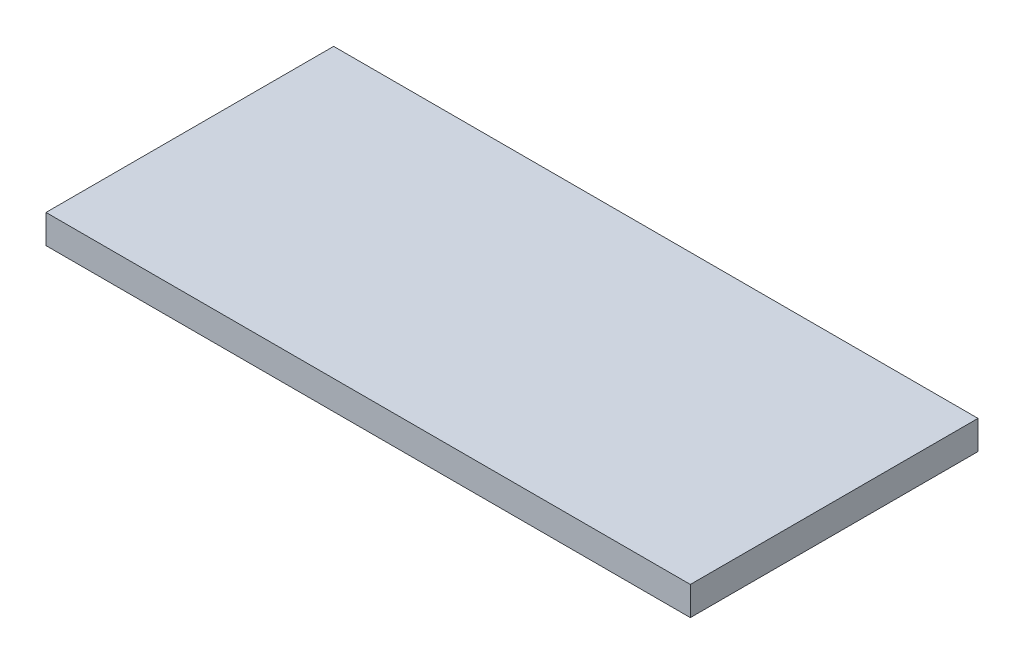
ISO-10303-21;
HEADER;
FILE_DESCRIPTION(('STEP AP214'),'2;1');
FILE_NAME('part.step','',(''),(''),'','','');
FILE_SCHEMA(('AUTOMOTIVE_DESIGN { 1 0 10303 214 1 1 1 1 }'));
ENDSEC;
DATA;
#1=APPLICATION_CONTEXT('core data for automotive mechanical design processes');
#2=APPLICATION_PROTOCOL_DEFINITION('international standard','automotive_design',2000,#1);
#3=PRODUCT_CONTEXT('',#1,'mechanical');
#4=PRODUCT('Part','Part','',(#3));
#5=PRODUCT_RELATED_PRODUCT_CATEGORY('part','',(#4));
#6=PRODUCT_DEFINITION_FORMATION('','',#4);
#7=PRODUCT_DEFINITION_CONTEXT('part definition',#1,'design');
#8=PRODUCT_DEFINITION('design','',#6,#7);
#9=PRODUCT_DEFINITION_SHAPE('','',#8);
#10=(LENGTH_UNIT() NAMED_UNIT(*) SI_UNIT(.MILLI.,.METRE.));
#11=(NAMED_UNIT(*) PLANE_ANGLE_UNIT() SI_UNIT($,.RADIAN.));
#12=(NAMED_UNIT(*) SI_UNIT($,.STERADIAN.) SOLID_ANGLE_UNIT());
#13=UNCERTAINTY_MEASURE_WITH_UNIT(LENGTH_MEASURE(1.E-05),#10,'distance_accuracy_value','');
#14=(GEOMETRIC_REPRESENTATION_CONTEXT(3) GLOBAL_UNCERTAINTY_ASSIGNED_CONTEXT((#13)) GLOBAL_UNIT_ASSIGNED_CONTEXT((#10,
#11,#12)) REPRESENTATION_CONTEXT('',''));
#15=CARTESIAN_POINT('',(0.,0.,0.));
#16=DIRECTION('',(0.,0.,1.));
#17=DIRECTION('',(1.,0.,0.));
#18=AXIS2_PLACEMENT_3D('',#15,#16,#17);
#19=CARTESIAN_POINT('',(-17.78,1.5875,7.9375));
#20=DIRECTION('',(1.,0.,0.));
#21=DIRECTION('',(0.,0.,-1.));
#22=AXIS2_PLACEMENT_3D('',#19,#20,#21);
#23=PLANE('',#22);
#24=DIRECTION('',(0.,0.,1.));
#25=VECTOR('',#24,1.);
#26=CARTESIAN_POINT('',(-17.78,0.,7.9375));
#27=LINE('',#26,#25);
#28=CARTESIAN_POINT('',(-17.78,0.,-7.9375));
#29=VERTEX_POINT('',#28);
#30=CARTESIAN_POINT('',(-17.78,0.,7.9375));
#31=VERTEX_POINT('',#30);
#32=EDGE_CURVE('E95',#29,#31,#27,.T.);
#33=ORIENTED_EDGE('',*,*,#32,.T.);
#34=DIRECTION('',(0.,-1.,0.));
#35=VECTOR('',#34,1.);
#36=CARTESIAN_POINT('',(-17.78,1.5875,7.9375));
#37=LINE('',#36,#35);
#38=CARTESIAN_POINT('',(-17.78,1.5875,7.9375));
#39=VERTEX_POINT('',#38);
#40=EDGE_CURVE('E11',#39,#31,#37,.T.);
#41=ORIENTED_EDGE('',*,*,#40,.F.);
#42=DIRECTION('',(0.,0.,1.));
#43=VECTOR('',#42,1.);
#44=CARTESIAN_POINT('',(-17.78,1.5875,7.9375));
#45=LINE('',#44,#43);
#46=CARTESIAN_POINT('',(-17.78,1.5875,-7.9375));
#47=VERTEX_POINT('',#46);
#48=EDGE_CURVE('E83',#47,#39,#45,.T.);
#49=ORIENTED_EDGE('',*,*,#48,.F.);
#50=DIRECTION('',(0.,-1.,0.));
#51=VECTOR('',#50,1.);
#52=CARTESIAN_POINT('',(-17.78,1.5875,-7.9375));
#53=LINE('',#52,#51);
#54=EDGE_CURVE('E91',#47,#29,#53,.T.);
#55=ORIENTED_EDGE('',*,*,#54,.T.);
#56=EDGE_LOOP('',(#33,#41,#49,#55));
#57=FACE_BOUND('',#56,.T.);
#58=ADVANCED_FACE('F32',(#57),#23,.F.);
#59=CARTESIAN_POINT('',(17.78,1.5875,7.9375));
#60=DIRECTION('',(0.,0.,-1.));
#61=DIRECTION('',(-1.,0.,0.));
#62=AXIS2_PLACEMENT_3D('',#59,#60,#61);
#63=PLANE('',#62);
#64=DIRECTION('',(1.,0.,0.));
#65=VECTOR('',#64,1.);
#66=CARTESIAN_POINT('',(17.78,0.,7.9375));
#67=LINE('',#66,#65);
#68=CARTESIAN_POINT('',(17.78,0.,7.9375));
#69=VERTEX_POINT('',#68);
#70=EDGE_CURVE('E87',#31,#69,#67,.T.);
#71=ORIENTED_EDGE('',*,*,#70,.T.);
#72=DIRECTION('',(0.,-1.,0.));
#73=VECTOR('',#72,1.);
#74=CARTESIAN_POINT('',(17.78,1.5875,7.9375));
#75=LINE('',#74,#73);
#76=CARTESIAN_POINT('',(17.78,1.5875,7.9375));
#77=VERTEX_POINT('',#76);
#78=EDGE_CURVE('E40',#77,#69,#75,.T.);
#79=ORIENTED_EDGE('',*,*,#78,.F.);
#80=DIRECTION('',(1.,0.,0.));
#81=VECTOR('',#80,1.);
#82=CARTESIAN_POINT('',(17.78,1.5875,7.9375));
#83=LINE('',#82,#81);
#84=EDGE_CURVE('E78',#39,#77,#83,.T.);
#85=ORIENTED_EDGE('',*,*,#84,.F.);
#86=ORIENTED_EDGE('',*,*,#40,.T.);
#87=EDGE_LOOP('',(#71,#79,#85,#86));
#88=FACE_BOUND('',#87,.T.);
#89=ADVANCED_FACE('F86',(#88),#63,.F.);
#90=CARTESIAN_POINT('',(17.78,1.5875,7.9375));
#91=DIRECTION('',(-1.,0.,0.));
#92=DIRECTION('',(0.,0.,1.));
#93=AXIS2_PLACEMENT_3D('',#90,#91,#92);
#94=PLANE('',#93);
#95=DIRECTION('',(0.,0.,-1.));
#96=VECTOR('',#95,1.);
#97=CARTESIAN_POINT('',(17.78,0.,7.9375));
#98=LINE('',#97,#96);
#99=CARTESIAN_POINT('',(17.78,0.,-7.9375));
#100=VERTEX_POINT('',#99);
#101=EDGE_CURVE('E65',#69,#100,#98,.T.);
#102=ORIENTED_EDGE('',*,*,#101,.T.);
#103=DIRECTION('',(0.,-1.,0.));
#104=VECTOR('',#103,1.);
#105=CARTESIAN_POINT('',(17.78,1.5875,-7.9375));
#106=LINE('',#105,#104);
#107=CARTESIAN_POINT('',(17.78,1.5875,-7.9375));
#108=VERTEX_POINT('',#107);
#109=EDGE_CURVE('E88',#108,#100,#106,.T.);
#110=ORIENTED_EDGE('',*,*,#109,.F.);
#111=DIRECTION('',(0.,0.,-1.));
#112=VECTOR('',#111,1.);
#113=CARTESIAN_POINT('',(17.78,1.5875,7.9375));
#114=LINE('',#113,#112);
#115=EDGE_CURVE('E81',#77,#108,#114,.T.);
#116=ORIENTED_EDGE('',*,*,#115,.F.);
#117=ORIENTED_EDGE('',*,*,#78,.T.);
#118=EDGE_LOOP('',(#102,#110,#116,#117));
#119=FACE_BOUND('',#118,.T.);
#120=ADVANCED_FACE('F89',(#119),#94,.F.);
#121=CARTESIAN_POINT('',(17.78,1.5875,-7.9375));
#122=DIRECTION('',(0.,0.,1.));
#123=DIRECTION('',(1.,0.,0.));
#124=AXIS2_PLACEMENT_3D('',#121,#122,#123);
#125=PLANE('',#124);
#126=DIRECTION('',(-1.,0.,0.));
#127=VECTOR('',#126,1.);
#128=CARTESIAN_POINT('',(17.78,0.,-7.9375));
#129=LINE('',#128,#127);
#130=EDGE_CURVE('E71',#100,#29,#129,.T.);
#131=ORIENTED_EDGE('',*,*,#130,.T.);
#132=ORIENTED_EDGE('',*,*,#54,.F.);
#133=DIRECTION('',(-1.,0.,0.));
#134=VECTOR('',#133,1.);
#135=CARTESIAN_POINT('',(17.78,1.5875,-7.9375));
#136=LINE('',#135,#134);
#137=EDGE_CURVE('E48',#108,#47,#136,.T.);
#138=ORIENTED_EDGE('',*,*,#137,.F.);
#139=ORIENTED_EDGE('',*,*,#109,.T.);
#140=EDGE_LOOP('',(#131,#132,#138,#139));
#141=FACE_BOUND('',#140,.T.);
#142=ADVANCED_FACE('F102',(#141),#125,.F.);
#143=CARTESIAN_POINT('',(0.,1.5875,0.));
#144=DIRECTION('',(0.,1.,0.));
#145=DIRECTION('',(0.,0.,1.));
#146=AXIS2_PLACEMENT_3D('',#143,#144,#145);
#147=PLANE('',#146);
#148=ORIENTED_EDGE('',*,*,#48,.T.);
#149=ORIENTED_EDGE('',*,*,#84,.T.);
#150=ORIENTED_EDGE('',*,*,#115,.T.);
#151=ORIENTED_EDGE('',*,*,#137,.T.);
#152=EDGE_LOOP('',(#148,#149,#150,#151));
#153=FACE_BOUND('',#152,.T.);
#154=ADVANCED_FACE('F79',(#153),#147,.T.);
#155=CARTESIAN_POINT('',(0.,0.,0.));
#156=DIRECTION('',(0.,1.,0.));
#157=DIRECTION('',(0.,0.,1.));
#158=AXIS2_PLACEMENT_3D('',#155,#156,#157);
#159=PLANE('',#158);
#160=ORIENTED_EDGE('',*,*,#32,.F.);
#161=ORIENTED_EDGE('',*,*,#130,.F.);
#162=ORIENTED_EDGE('',*,*,#101,.F.);
#163=ORIENTED_EDGE('',*,*,#70,.F.);
#164=EDGE_LOOP('',(#160,#161,#162,#163));
#165=FACE_BOUND('',#164,.T.);
#166=ADVANCED_FACE('F105',(#165),#159,.F.);
#167=CLOSED_SHELL('',(#58,#89,#120,#142,#154,#166));
#168=MANIFOLD_SOLID_BREP('B2',#167);
#169=ADVANCED_BREP_SHAPE_REPRESENTATION('',(#18,#168),#14);
#170=SHAPE_DEFINITION_REPRESENTATION(#9,#169);
ENDSEC;
END-ISO-10303-21;
